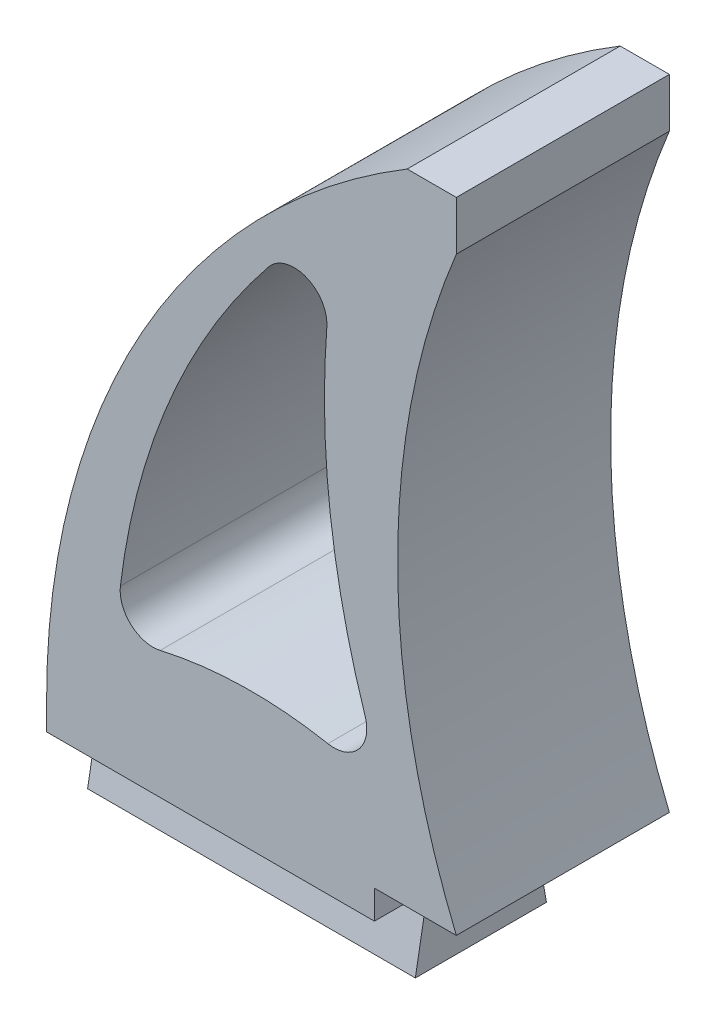
ISO-10303-21;
HEADER;
FILE_DESCRIPTION(('STEP AP214'),'2;1');
FILE_NAME('part.step','',(''),(''),'','','');
FILE_SCHEMA(('AUTOMOTIVE_DESIGN { 1 0 10303 214 1 1 1 1 }'));
ENDSEC;
DATA;
#1=APPLICATION_CONTEXT('core data for automotive mechanical design processes');
#2=APPLICATION_PROTOCOL_DEFINITION('international standard','automotive_design',2000,#1);
#3=PRODUCT_CONTEXT('',#1,'mechanical');
#4=PRODUCT('Part','Part','',(#3));
#5=PRODUCT_RELATED_PRODUCT_CATEGORY('part','',(#4));
#6=PRODUCT_DEFINITION_FORMATION('','',#4);
#7=PRODUCT_DEFINITION_CONTEXT('part definition',#1,'design');
#8=PRODUCT_DEFINITION('design','',#6,#7);
#9=PRODUCT_DEFINITION_SHAPE('','',#8);
#10=(LENGTH_UNIT() NAMED_UNIT(*) SI_UNIT(.MILLI.,.METRE.));
#11=(NAMED_UNIT(*) PLANE_ANGLE_UNIT() SI_UNIT($,.RADIAN.));
#12=(NAMED_UNIT(*) SI_UNIT($,.STERADIAN.) SOLID_ANGLE_UNIT());
#13=UNCERTAINTY_MEASURE_WITH_UNIT(LENGTH_MEASURE(1.E-05),#10,'distance_accuracy_value','');
#14=(GEOMETRIC_REPRESENTATION_CONTEXT(3) GLOBAL_UNCERTAINTY_ASSIGNED_CONTEXT((#13)) GLOBAL_UNIT_ASSIGNED_CONTEXT((#10,
#11,#12)) REPRESENTATION_CONTEXT('',''));
#15=CARTESIAN_POINT('',(0.,0.,0.));
#16=DIRECTION('',(0.,0.,1.));
#17=DIRECTION('',(1.,0.,0.));
#18=AXIS2_PLACEMENT_3D('',#15,#16,#17);
#19=CARTESIAN_POINT('',(45.5681818181818,6.,6.5));
#20=DIRECTION('',(0.,0.,-1.));
#21=DIRECTION('',(-1.,0.,0.));
#22=AXIS2_PLACEMENT_3D('',#19,#20,#21);
#23=PLANE('',#22);
#24=DIRECTION('',(0.,-1.,0.));
#25=VECTOR('',#24,1.);
#26=CARTESIAN_POINT('',(0.,0.,6.5));
#27=LINE('',#26,#25);
#28=CARTESIAN_POINT('',(0.,6.00000000000001,6.5));
#29=VERTEX_POINT('',#28);
#30=CARTESIAN_POINT('',(0.,4.25346136471317,6.5));
#31=VERTEX_POINT('',#30);
#32=EDGE_CURVE('E296',#29,#31,#27,.T.);
#33=ORIENTED_EDGE('',*,*,#32,.T.);
#34=DIRECTION('',(1.,0.,0.));
#35=VECTOR('',#34,1.);
#36=CARTESIAN_POINT('',(45.5681818181818,4.25346136471317,6.5));
#37=LINE('',#36,#35);
#38=CARTESIAN_POINT('',(20.,4.25346136471317,6.5));
#39=VERTEX_POINT('',#38);
#40=EDGE_CURVE('E11',#31,#39,#37,.T.);
#41=ORIENTED_EDGE('',*,*,#40,.T.);
#42=DIRECTION('',(0.,1.,0.));
#43=VECTOR('',#42,1.);
#44=CARTESIAN_POINT('',(20.,6.,6.5));
#45=LINE('',#44,#43);
#46=CARTESIAN_POINT('',(20.,6.,6.5));
#47=VERTEX_POINT('',#46);
#48=EDGE_CURVE('E277',#39,#47,#45,.T.);
#49=ORIENTED_EDGE('',*,*,#48,.T.);
#50=DIRECTION('',(1.,0.,0.));
#51=VECTOR('',#50,1.);
#52=CARTESIAN_POINT('',(25.,6.,6.5));
#53=LINE('',#52,#51);
#54=CARTESIAN_POINT('',(25.,6.00000000000001,6.5));
#55=VERTEX_POINT('',#54);
#56=EDGE_CURVE('E280',#47,#55,#53,.T.);
#57=ORIENTED_EDGE('',*,*,#56,.T.);
#58=CARTESIAN_POINT('',(68.4165866921848,24.,6.5));
#59=DIRECTION('',(0.,0.,-1.));
#60=DIRECTION('',(1.,0.,0.));
#61=AXIS2_PLACEMENT_3D('',#58,#59,#60);
#62=CIRCLE('',#61,47.);
#63=CARTESIAN_POINT('',(25.,42.,6.5));
#64=VERTEX_POINT('',#63);
#65=EDGE_CURVE('E284',#55,#64,#62,.T.);
#66=ORIENTED_EDGE('',*,*,#65,.T.);
#67=DIRECTION('',(0.,1.,0.));
#68=VECTOR('',#67,1.);
#69=CARTESIAN_POINT('',(25.,45.,6.5));
#70=LINE('',#69,#68);
#71=CARTESIAN_POINT('',(25.,45.,6.5));
#72=VERTEX_POINT('',#71);
#73=EDGE_CURVE('E287',#64,#72,#70,.T.);
#74=ORIENTED_EDGE('',*,*,#73,.T.);
#75=DIRECTION('',(-1.,0.,0.));
#76=VECTOR('',#75,1.);
#77=CARTESIAN_POINT('',(22.,45.,6.5));
#78=LINE('',#77,#76);
#79=CARTESIAN_POINT('',(22.,45.,6.5));
#80=VERTEX_POINT('',#79);
#81=EDGE_CURVE('E290',#72,#80,#78,.T.);
#82=ORIENTED_EDGE('',*,*,#81,.T.);
#83=CARTESIAN_POINT('',(45.5681818181818,6.,6.5));
#84=DIRECTION('',(0.,0.,1.));
#85=DIRECTION('',(-1.,0.,0.));
#86=AXIS2_PLACEMENT_3D('',#83,#84,#85);
#87=CIRCLE('',#86,45.5681818181818);
#88=EDGE_CURVE('E293',#80,#29,#87,.T.);
#89=ORIENTED_EDGE('',*,*,#88,.T.);
#90=EDGE_LOOP('',(#33,#41,#49,#57,#66,#74,#82,#89));
#91=FACE_BOUND('',#90,.T.);
#92=CARTESIAN_POINT('',(66.9514471110929,30.3695876679392,6.5));
#93=DIRECTION('',(0.,0.,-1.));
#94=DIRECTION('',(1.,0.,0.));
#95=AXIS2_PLACEMENT_3D('',#92,#93,#94);
#96=CIRCLE('',#95,50.);
#97=CARTESIAN_POINT('',(19.4364389930086,14.8028280970333,6.5));
#98=VERTEX_POINT('',#97);
#99=CARTESIAN_POINT('',(17.0977685869204,34.1919871248865,6.5));
#100=VERTEX_POINT('',#99);
#101=EDGE_CURVE('E205',#98,#100,#96,.T.);
#102=ORIENTED_EDGE('',*,*,#101,.F.);
#103=CARTESIAN_POINT('',(17.5358386682853,14.180157714197,6.5));
#104=DIRECTION('',(0.,0.,1.));
#105=DIRECTION('',(1.,0.,0.));
#106=AXIS2_PLACEMENT_3D('',#103,#104,#105);
#107=CIRCLE('',#106,2.);
#108=CARTESIAN_POINT('',(17.1628135817456,12.215252554956,6.5));
#109=VERTEX_POINT('',#108);
#110=EDGE_CURVE('E54',#109,#98,#107,.T.);
#111=ORIENTED_EDGE('',*,*,#110,.F.);
#112=CARTESIAN_POINT('',(12.5,-12.3460619355571,6.5));
#113=DIRECTION('',(0.,0.,-1.));
#114=DIRECTION('',(-1.,0.,0.));
#115=AXIS2_PLACEMENT_3D('',#112,#113,#114);
#116=CIRCLE('',#115,25.);
#117=CARTESIAN_POINT('',(6.9324638605244,12.026105414427,6.5));
#118=VERTEX_POINT('',#117);
#119=EDGE_CURVE('E185',#118,#109,#116,.T.);
#120=ORIENTED_EDGE('',*,*,#119,.F.);
#121=CARTESIAN_POINT('',(6.48706096936636,13.9758788024258,6.5));
#122=DIRECTION('',(0.,0.,1.));
#123=DIRECTION('',(-1.,0.,0.));
#124=AXIS2_PLACEMENT_3D('',#121,#122,#123);
#125=CIRCLE('',#124,2.);
#126=CARTESIAN_POINT('',(4.50146521068511,14.2154815634846,6.5));
#127=VERTEX_POINT('',#126);
#128=EDGE_CURVE('E189',#127,#118,#125,.T.);
#129=ORIENTED_EDGE('',*,*,#128,.F.);
#130=CARTESIAN_POINT('',(46.1989761429913,9.18382358124811,6.5));
#131=DIRECTION('',(0.,0.,1.));
#132=DIRECTION('',(-1.,0.,0.));
#133=AXIS2_PLACEMENT_3D('',#130,#131,#132);
#134=CIRCLE('',#133,42.);
#135=CARTESIAN_POINT('',(13.5488537111016,35.6029360792602,6.5));
#136=VERTEX_POINT('',#135);
#137=EDGE_CURVE('E212',#136,#127,#134,.T.);
#138=ORIENTED_EDGE('',*,*,#137,.F.);
#139=CARTESIAN_POINT('',(15.1036214459535,34.3448831031643,6.5));
#140=DIRECTION('',(0.,0.,1.));
#141=DIRECTION('',(-1.,0.,0.));
#142=AXIS2_PLACEMENT_3D('',#139,#140,#141);
#143=CIRCLE('',#142,2.);
#144=EDGE_CURVE('E208',#100,#136,#143,.T.);
#145=ORIENTED_EDGE('',*,*,#144,.F.);
#146=EDGE_LOOP('',(#102,#111,#120,#129,#138,#145));
#147=FACE_BOUND('',#146,.T.);
#148=ADVANCED_FACE('F38',(#91,#147),#23,.F.);
#149=CARTESIAN_POINT('',(45.5681818181818,6.,-6.5));
#150=DIRECTION('',(0.,0.,-1.));
#151=DIRECTION('',(-1.,0.,0.));
#152=AXIS2_PLACEMENT_3D('',#149,#150,#151);
#153=PLANE('',#152);
#154=DIRECTION('',(1.,0.,0.));
#155=VECTOR('',#154,1.);
#156=CARTESIAN_POINT('',(45.5681818181818,4.25346136471317,-6.5));
#157=LINE('',#156,#155);
#158=CARTESIAN_POINT('',(0.,4.25346136471317,-6.5));
#159=VERTEX_POINT('',#158);
#160=CARTESIAN_POINT('',(20.,4.25346136471317,-6.5));
#161=VERTEX_POINT('',#160);
#162=EDGE_CURVE('E47',#159,#161,#157,.T.);
#163=ORIENTED_EDGE('',*,*,#162,.F.);
#164=DIRECTION('',(0.,-1.,0.));
#165=VECTOR('',#164,1.);
#166=CARTESIAN_POINT('',(0.,0.,-6.5));
#167=LINE('',#166,#165);
#168=CARTESIAN_POINT('',(0.,6.00000000000001,-6.5));
#169=VERTEX_POINT('',#168);
#170=EDGE_CURVE('E281',#169,#159,#167,.T.);
#171=ORIENTED_EDGE('',*,*,#170,.F.);
#172=CARTESIAN_POINT('',(45.5681818181818,6.,-6.5));
#173=DIRECTION('',(0.,0.,1.));
#174=DIRECTION('',(-1.,0.,0.));
#175=AXIS2_PLACEMENT_3D('',#172,#173,#174);
#176=CIRCLE('',#175,45.5681818181818);
#177=CARTESIAN_POINT('',(22.,45.,-6.5));
#178=VERTEX_POINT('',#177);
#179=EDGE_CURVE('E315',#178,#169,#176,.T.);
#180=ORIENTED_EDGE('',*,*,#179,.F.);
#181=DIRECTION('',(-1.,0.,0.));
#182=VECTOR('',#181,1.);
#183=CARTESIAN_POINT('',(22.,45.,-6.5));
#184=LINE('',#183,#182);
#185=CARTESIAN_POINT('',(25.,45.,-6.5));
#186=VERTEX_POINT('',#185);
#187=EDGE_CURVE('E312',#186,#178,#184,.T.);
#188=ORIENTED_EDGE('',*,*,#187,.F.);
#189=DIRECTION('',(0.,1.,0.));
#190=VECTOR('',#189,1.);
#191=CARTESIAN_POINT('',(25.,45.,-6.5));
#192=LINE('',#191,#190);
#193=CARTESIAN_POINT('',(25.,42.,-6.5));
#194=VERTEX_POINT('',#193);
#195=EDGE_CURVE('E309',#194,#186,#192,.T.);
#196=ORIENTED_EDGE('',*,*,#195,.F.);
#197=CARTESIAN_POINT('',(68.4165866921848,24.,-6.5));
#198=DIRECTION('',(0.,0.,-1.));
#199=DIRECTION('',(1.,0.,0.));
#200=AXIS2_PLACEMENT_3D('',#197,#198,#199);
#201=CIRCLE('',#200,47.);
#202=CARTESIAN_POINT('',(25.,6.00000000000001,-6.5));
#203=VERTEX_POINT('',#202);
#204=EDGE_CURVE('E306',#203,#194,#201,.T.);
#205=ORIENTED_EDGE('',*,*,#204,.F.);
#206=DIRECTION('',(1.,0.,0.));
#207=VECTOR('',#206,1.);
#208=CARTESIAN_POINT('',(25.,6.,-6.5));
#209=LINE('',#208,#207);
#210=CARTESIAN_POINT('',(20.,6.,-6.5));
#211=VERTEX_POINT('',#210);
#212=EDGE_CURVE('E303',#211,#203,#209,.T.);
#213=ORIENTED_EDGE('',*,*,#212,.F.);
#214=DIRECTION('',(0.,1.,0.));
#215=VECTOR('',#214,1.);
#216=CARTESIAN_POINT('',(20.,6.,-6.5));
#217=LINE('',#216,#215);
#218=EDGE_CURVE('E276',#161,#211,#217,.T.);
#219=ORIENTED_EDGE('',*,*,#218,.F.);
#220=EDGE_LOOP('',(#163,#171,#180,#188,#196,#205,#213,#219));
#221=FACE_BOUND('',#220,.T.);
#222=CARTESIAN_POINT('',(17.5358386682853,14.180157714197,-6.5));
#223=DIRECTION('',(0.,0.,1.));
#224=DIRECTION('',(1.,0.,0.));
#225=AXIS2_PLACEMENT_3D('',#222,#223,#224);
#226=CIRCLE('',#225,2.);
#227=CARTESIAN_POINT('',(17.1628135817456,12.215252554956,-6.5));
#228=VERTEX_POINT('',#227);
#229=CARTESIAN_POINT('',(19.4364389930086,14.8028280970333,-6.5));
#230=VERTEX_POINT('',#229);
#231=EDGE_CURVE('E166',#228,#230,#226,.T.);
#232=ORIENTED_EDGE('',*,*,#231,.T.);
#233=CARTESIAN_POINT('',(66.9514471110929,30.3695876679392,-6.5));
#234=DIRECTION('',(0.,0.,-1.));
#235=DIRECTION('',(1.,0.,0.));
#236=AXIS2_PLACEMENT_3D('',#233,#234,#235);
#237=CIRCLE('',#236,50.);
#238=CARTESIAN_POINT('',(17.0977685869204,34.1919871248865,-6.5));
#239=VERTEX_POINT('',#238);
#240=EDGE_CURVE('E176',#230,#239,#237,.T.);
#241=ORIENTED_EDGE('',*,*,#240,.T.);
#242=CARTESIAN_POINT('',(15.1036214459535,34.3448831031643,-6.5));
#243=DIRECTION('',(0.,0.,1.));
#244=DIRECTION('',(-1.,0.,0.));
#245=AXIS2_PLACEMENT_3D('',#242,#243,#244);
#246=CIRCLE('',#245,2.);
#247=CARTESIAN_POINT('',(13.5488537111016,35.6029360792602,-6.5));
#248=VERTEX_POINT('',#247);
#249=EDGE_CURVE('E62',#239,#248,#246,.T.);
#250=ORIENTED_EDGE('',*,*,#249,.T.);
#251=CARTESIAN_POINT('',(46.1989761429913,9.18382358124811,-6.5));
#252=DIRECTION('',(0.,0.,1.));
#253=DIRECTION('',(-1.,0.,0.));
#254=AXIS2_PLACEMENT_3D('',#251,#252,#253);
#255=CIRCLE('',#254,42.);
#256=CARTESIAN_POINT('',(4.50146521068511,14.2154815634846,-6.5));
#257=VERTEX_POINT('',#256);
#258=EDGE_CURVE('E194',#248,#257,#255,.T.);
#259=ORIENTED_EDGE('',*,*,#258,.T.);
#260=CARTESIAN_POINT('',(6.48706096936636,13.9758788024258,-6.5));
#261=DIRECTION('',(0.,0.,1.));
#262=DIRECTION('',(-1.,0.,0.));
#263=AXIS2_PLACEMENT_3D('',#260,#261,#262);
#264=CIRCLE('',#263,2.);
#265=CARTESIAN_POINT('',(6.9324638605244,12.026105414427,-6.5));
#266=VERTEX_POINT('',#265);
#267=EDGE_CURVE('E198',#257,#266,#264,.T.);
#268=ORIENTED_EDGE('',*,*,#267,.T.);
#269=CARTESIAN_POINT('',(12.5,-12.3460619355571,-6.5));
#270=DIRECTION('',(0.,0.,-1.));
#271=DIRECTION('',(-1.,0.,0.));
#272=AXIS2_PLACEMENT_3D('',#269,#270,#271);
#273=CIRCLE('',#272,25.);
#274=EDGE_CURVE('E173',#266,#228,#273,.T.);
#275=ORIENTED_EDGE('',*,*,#274,.T.);
#276=EDGE_LOOP('',(#232,#241,#250,#259,#268,#275));
#277=FACE_BOUND('',#276,.T.);
#278=ADVANCED_FACE('F181',(#221,#277),#153,.T.);
#279=CARTESIAN_POINT('',(20.,0.,6.5));
#280=DIRECTION('',(0.,1.,0.));
#281=DIRECTION('',(-1.,0.,0.));
#282=AXIS2_PLACEMENT_3D('',#279,#280,#281);
#283=PLANE('',#282);
#284=DIRECTION('',(0.,0.,-1.));
#285=VECTOR('',#284,1.);
#286=CARTESIAN_POINT('',(20.,0.,6.5));
#287=LINE('',#286,#285);
#288=CARTESIAN_POINT('',(20.,0.,4.));
#289=VERTEX_POINT('',#288);
#290=CARTESIAN_POINT('',(20.,0.,-4.));
#291=VERTEX_POINT('',#290);
#292=EDGE_CURVE('E348',#289,#291,#287,.T.);
#293=ORIENTED_EDGE('',*,*,#292,.F.);
#294=DIRECTION('',(-1.,0.,0.));
#295=VECTOR('',#294,1.);
#296=CARTESIAN_POINT('',(25.,0.,4.));
#297=LINE('',#296,#295);
#298=CARTESIAN_POINT('',(0.,0.,4.));
#299=VERTEX_POINT('',#298);
#300=EDGE_CURVE('E243',#289,#299,#297,.T.);
#301=ORIENTED_EDGE('',*,*,#300,.T.);
#302=DIRECTION('',(0.,0.,-1.));
#303=VECTOR('',#302,1.);
#304=CARTESIAN_POINT('',(0.,0.,6.5));
#305=LINE('',#304,#303);
#306=CARTESIAN_POINT('',(0.,0.,-4.));
#307=VERTEX_POINT('',#306);
#308=EDGE_CURVE('E300',#299,#307,#305,.T.);
#309=ORIENTED_EDGE('',*,*,#308,.T.);
#310=DIRECTION('',(-1.,0.,0.));
#311=VECTOR('',#310,1.);
#312=CARTESIAN_POINT('',(25.,0.,-4.));
#313=LINE('',#312,#311);
#314=EDGE_CURVE('E239',#291,#307,#313,.T.);
#315=ORIENTED_EDGE('',*,*,#314,.F.);
#316=EDGE_LOOP('',(#293,#301,#309,#315));
#317=FACE_BOUND('',#316,.T.);
#318=ADVANCED_FACE('F40',(#317),#283,.F.);
#319=CARTESIAN_POINT('',(20.,6.,6.5));
#320=DIRECTION('',(-1.,0.,0.));
#321=DIRECTION('',(0.,0.,1.));
#322=AXIS2_PLACEMENT_3D('',#319,#320,#321);
#323=PLANE('',#322);
#324=DIRECTION('',(0.,0.,-1.));
#325=VECTOR('',#324,1.);
#326=CARTESIAN_POINT('',(20.,4.25346136471317,6.5));
#327=LINE('',#326,#325);
#328=CARTESIAN_POINT('',(20.,4.25346136471317,3.25));
#329=VERTEX_POINT('',#328);
#330=EDGE_CURVE('E264',#39,#329,#327,.T.);
#331=ORIENTED_EDGE('',*,*,#330,.T.);
#332=DIRECTION('',(0.,-0.984807753012207,0.173648177666935));
#333=VECTOR('',#332,1.);
#334=CARTESIAN_POINT('',(20.,5.39155268320062,3.04932379404059));
#335=LINE('',#334,#333);
#336=EDGE_CURVE('E272',#329,#289,#335,.T.);
#337=ORIENTED_EDGE('',*,*,#336,.T.);
#338=ORIENTED_EDGE('',*,*,#292,.T.);
#339=DIRECTION('',(0.,0.984807753012207,0.173648177666935));
#340=VECTOR('',#339,1.);
#341=CARTESIAN_POINT('',(20.,7.61468361481752,-2.65732582914897));
#342=LINE('',#341,#340);
#343=CARTESIAN_POINT('',(20.,4.25346136471317,-3.25));
#344=VERTEX_POINT('',#343);
#345=EDGE_CURVE('E268',#291,#344,#342,.T.);
#346=ORIENTED_EDGE('',*,*,#345,.T.);
#347=DIRECTION('',(0.,0.,-1.));
#348=VECTOR('',#347,1.);
#349=CARTESIAN_POINT('',(20.,4.25346136471317,6.5));
#350=LINE('',#349,#348);
#351=EDGE_CURVE('E247',#344,#161,#350,.T.);
#352=ORIENTED_EDGE('',*,*,#351,.T.);
#353=ORIENTED_EDGE('',*,*,#218,.T.);
#354=DIRECTION('',(0.,0.,-1.));
#355=VECTOR('',#354,1.);
#356=CARTESIAN_POINT('',(20.,6.,6.5));
#357=LINE('',#356,#355);
#358=EDGE_CURVE('E344',#47,#211,#357,.T.);
#359=ORIENTED_EDGE('',*,*,#358,.F.);
#360=ORIENTED_EDGE('',*,*,#48,.F.);
#361=EDGE_LOOP('',(#331,#337,#338,#346,#352,#353,#359,#360));
#362=FACE_BOUND('',#361,.T.);
#363=ADVANCED_FACE('F361',(#362),#323,.F.);
#364=CARTESIAN_POINT('',(25.,6.,6.5));
#365=DIRECTION('',(0.,1.,0.));
#366=DIRECTION('',(0.,0.,1.));
#367=AXIS2_PLACEMENT_3D('',#364,#365,#366);
#368=PLANE('',#367);
#369=ORIENTED_EDGE('',*,*,#212,.T.);
#370=DIRECTION('',(0.,0.,-1.));
#371=VECTOR('',#370,1.);
#372=CARTESIAN_POINT('',(25.,6.00000000000001,6.5));
#373=LINE('',#372,#371);
#374=EDGE_CURVE('E340',#55,#203,#373,.T.);
#375=ORIENTED_EDGE('',*,*,#374,.F.);
#376=ORIENTED_EDGE('',*,*,#56,.F.);
#377=ORIENTED_EDGE('',*,*,#358,.T.);
#378=EDGE_LOOP('',(#369,#375,#376,#377));
#379=FACE_BOUND('',#378,.T.);
#380=ADVANCED_FACE('F368',(#379),#368,.F.);
#381=CARTESIAN_POINT('',(68.4165866921848,24.,6.5));
#382=DIRECTION('',(0.,0.,-1.));
#383=DIRECTION('',(-1.,0.,0.));
#384=AXIS2_PLACEMENT_3D('',#381,#382,#383);
#385=CYLINDRICAL_SURFACE('',#384,47.);
#386=ORIENTED_EDGE('',*,*,#204,.T.);
#387=DIRECTION('',(0.,0.,-1.));
#388=VECTOR('',#387,1.);
#389=CARTESIAN_POINT('',(25.,42.,6.5));
#390=LINE('',#389,#388);
#391=EDGE_CURVE('E336',#64,#194,#390,.T.);
#392=ORIENTED_EDGE('',*,*,#391,.F.);
#393=ORIENTED_EDGE('',*,*,#65,.F.);
#394=ORIENTED_EDGE('',*,*,#374,.T.);
#395=EDGE_LOOP('',(#386,#392,#393,#394));
#396=FACE_BOUND('',#395,.T.);
#397=ADVANCED_FACE('F372',(#396),#385,.F.);
#398=CARTESIAN_POINT('',(25.,45.,6.5));
#399=DIRECTION('',(-1.,0.,0.));
#400=DIRECTION('',(0.,0.,1.));
#401=AXIS2_PLACEMENT_3D('',#398,#399,#400);
#402=PLANE('',#401);
#403=ORIENTED_EDGE('',*,*,#195,.T.);
#404=DIRECTION('',(0.,0.,-1.));
#405=VECTOR('',#404,1.);
#406=CARTESIAN_POINT('',(25.,45.,6.5));
#407=LINE('',#406,#405);
#408=EDGE_CURVE('E332',#72,#186,#407,.T.);
#409=ORIENTED_EDGE('',*,*,#408,.F.);
#410=ORIENTED_EDGE('',*,*,#73,.F.);
#411=ORIENTED_EDGE('',*,*,#391,.T.);
#412=EDGE_LOOP('',(#403,#409,#410,#411));
#413=FACE_BOUND('',#412,.T.);
#414=ADVANCED_FACE('F417',(#413),#402,.F.);
#415=CARTESIAN_POINT('',(22.,45.,6.5));
#416=DIRECTION('',(0.,-1.,0.));
#417=DIRECTION('',(0.,0.,-1.));
#418=AXIS2_PLACEMENT_3D('',#415,#416,#417);
#419=PLANE('',#418);
#420=ORIENTED_EDGE('',*,*,#187,.T.);
#421=DIRECTION('',(0.,0.,-1.));
#422=VECTOR('',#421,1.);
#423=CARTESIAN_POINT('',(22.,45.,6.5));
#424=LINE('',#423,#422);
#425=EDGE_CURVE('E328',#80,#178,#424,.T.);
#426=ORIENTED_EDGE('',*,*,#425,.F.);
#427=ORIENTED_EDGE('',*,*,#81,.F.);
#428=ORIENTED_EDGE('',*,*,#408,.T.);
#429=EDGE_LOOP('',(#420,#426,#427,#428));
#430=FACE_BOUND('',#429,.T.);
#431=ADVANCED_FACE('F413',(#430),#419,.F.);
#432=CARTESIAN_POINT('',(45.5681818181818,6.,6.5));
#433=DIRECTION('',(0.,0.,-1.));
#434=DIRECTION('',(-1.,0.,0.));
#435=AXIS2_PLACEMENT_3D('',#432,#433,#434);
#436=CYLINDRICAL_SURFACE('',#435,45.5681818181818);
#437=ORIENTED_EDGE('',*,*,#179,.T.);
#438=DIRECTION('',(0.,0.,-1.));
#439=VECTOR('',#438,1.);
#440=CARTESIAN_POINT('',(0.,6.00000000000001,6.5));
#441=LINE('',#440,#439);
#442=EDGE_CURVE('E324',#29,#169,#441,.T.);
#443=ORIENTED_EDGE('',*,*,#442,.F.);
#444=ORIENTED_EDGE('',*,*,#88,.F.);
#445=ORIENTED_EDGE('',*,*,#425,.T.);
#446=EDGE_LOOP('',(#437,#443,#444,#445));
#447=FACE_BOUND('',#446,.T.);
#448=ADVANCED_FACE('F402',(#447),#436,.T.);
#449=CARTESIAN_POINT('',(0.,0.,6.5));
#450=DIRECTION('',(1.,0.,0.));
#451=DIRECTION('',(0.,0.,-1.));
#452=AXIS2_PLACEMENT_3D('',#449,#450,#451);
#453=PLANE('',#452);
#454=ORIENTED_EDGE('',*,*,#308,.F.);
#455=DIRECTION('',(0.,-0.984807753012207,0.173648177666935));
#456=VECTOR('',#455,1.);
#457=CARTESIAN_POINT('',(0.,4.25346136471317,3.25));
#458=LINE('',#457,#456);
#459=CARTESIAN_POINT('',(0.,4.25346136471317,3.25));
#460=VERTEX_POINT('',#459);
#461=EDGE_CURVE('E238',#460,#299,#458,.T.);
#462=ORIENTED_EDGE('',*,*,#461,.F.);
#463=DIRECTION('',(0.,0.,-1.));
#464=VECTOR('',#463,1.);
#465=CARTESIAN_POINT('',(0.,4.25346136471317,6.5));
#466=LINE('',#465,#464);
#467=EDGE_CURVE('E234',#31,#460,#466,.T.);
#468=ORIENTED_EDGE('',*,*,#467,.F.);
#469=ORIENTED_EDGE('',*,*,#32,.F.);
#470=ORIENTED_EDGE('',*,*,#442,.T.);
#471=ORIENTED_EDGE('',*,*,#170,.T.);
#472=DIRECTION('',(0.,0.,-1.));
#473=VECTOR('',#472,1.);
#474=CARTESIAN_POINT('',(0.,4.25346136471317,-6.5));
#475=LINE('',#474,#473);
#476=CARTESIAN_POINT('',(0.,4.25346136471317,-3.25));
#477=VERTEX_POINT('',#476);
#478=EDGE_CURVE('E253',#477,#159,#475,.T.);
#479=ORIENTED_EDGE('',*,*,#478,.F.);
#480=DIRECTION('',(0.,0.984807753012207,0.173648177666935));
#481=VECTOR('',#480,1.);
#482=CARTESIAN_POINT('',(0.,4.25346136471317,-3.25));
#483=LINE('',#482,#481);
#484=EDGE_CURVE('E222',#307,#477,#483,.T.);
#485=ORIENTED_EDGE('',*,*,#484,.F.);
#486=EDGE_LOOP('',(#454,#462,#468,#469,#470,#471,#479,#485));
#487=FACE_BOUND('',#486,.T.);
#488=ADVANCED_FACE('F392',(#487),#453,.F.);
#489=CARTESIAN_POINT('',(25.,4.25346136471317,-3.25));
#490=DIRECTION('',(0.,-0.173648177666935,0.984807753012207));
#491=DIRECTION('',(0.,-0.984807753012207,-0.173648177666935));
#492=AXIS2_PLACEMENT_3D('',#489,#490,#491);
#493=PLANE('',#492);
#494=ORIENTED_EDGE('',*,*,#314,.T.);
#495=ORIENTED_EDGE('',*,*,#484,.T.);
#496=DIRECTION('',(-1.,0.,0.));
#497=VECTOR('',#496,1.);
#498=CARTESIAN_POINT('',(25.,4.25346136471317,-3.25));
#499=LINE('',#498,#497);
#500=EDGE_CURVE('E256',#344,#477,#499,.T.);
#501=ORIENTED_EDGE('',*,*,#500,.F.);
#502=ORIENTED_EDGE('',*,*,#345,.F.);
#503=EDGE_LOOP('',(#494,#495,#501,#502));
#504=FACE_BOUND('',#503,.T.);
#505=ADVANCED_FACE('F394',(#504),#493,.F.);
#506=CARTESIAN_POINT('',(25.,4.25346136471317,-6.5));
#507=DIRECTION('',(0.,1.,0.));
#508=DIRECTION('',(0.,0.,1.));
#509=AXIS2_PLACEMENT_3D('',#506,#507,#508);
#510=PLANE('',#509);
#511=ORIENTED_EDGE('',*,*,#500,.T.);
#512=ORIENTED_EDGE('',*,*,#478,.T.);
#513=ORIENTED_EDGE('',*,*,#162,.T.);
#514=ORIENTED_EDGE('',*,*,#351,.F.);
#515=EDGE_LOOP('',(#511,#512,#513,#514));
#516=FACE_BOUND('',#515,.T.);
#517=ADVANCED_FACE('F354',(#516),#510,.F.);
#518=CARTESIAN_POINT('',(25.,4.25346136471317,3.25));
#519=DIRECTION('',(0.,-0.173648177666935,-0.984807753012207));
#520=DIRECTION('',(0.,0.984807753012207,-0.173648177666935));
#521=AXIS2_PLACEMENT_3D('',#518,#519,#520);
#522=PLANE('',#521);
#523=DIRECTION('',(-1.,0.,0.));
#524=VECTOR('',#523,1.);
#525=CARTESIAN_POINT('',(25.,4.25346136471317,3.25));
#526=LINE('',#525,#524);
#527=EDGE_CURVE('E242',#329,#460,#526,.T.);
#528=ORIENTED_EDGE('',*,*,#527,.T.);
#529=ORIENTED_EDGE('',*,*,#461,.T.);
#530=ORIENTED_EDGE('',*,*,#300,.F.);
#531=ORIENTED_EDGE('',*,*,#336,.F.);
#532=EDGE_LOOP('',(#528,#529,#530,#531));
#533=FACE_BOUND('',#532,.T.);
#534=ADVANCED_FACE('F386',(#533),#522,.F.);
#535=CARTESIAN_POINT('',(25.,4.25346136471317,6.5));
#536=DIRECTION('',(0.,1.,0.));
#537=DIRECTION('',(0.,0.,1.));
#538=AXIS2_PLACEMENT_3D('',#535,#536,#537);
#539=PLANE('',#538);
#540=ORIENTED_EDGE('',*,*,#40,.F.);
#541=ORIENTED_EDGE('',*,*,#467,.T.);
#542=ORIENTED_EDGE('',*,*,#527,.F.);
#543=ORIENTED_EDGE('',*,*,#330,.F.);
#544=EDGE_LOOP('',(#540,#541,#542,#543));
#545=FACE_BOUND('',#544,.T.);
#546=ADVANCED_FACE('F382',(#545),#539,.F.);
#547=CARTESIAN_POINT('',(17.5358386682853,14.180157714197,-6.5));
#548=DIRECTION('',(0.,0.,1.));
#549=DIRECTION('',(1.,0.,0.));
#550=AXIS2_PLACEMENT_3D('',#547,#548,#549);
#551=CYLINDRICAL_SURFACE('',#550,2.);
#552=ORIENTED_EDGE('',*,*,#110,.T.);
#553=DIRECTION('',(0.,0.,1.));
#554=VECTOR('',#553,1.);
#555=CARTESIAN_POINT('',(19.4364389930086,14.8028280970333,-6.5));
#556=LINE('',#555,#554);
#557=EDGE_CURVE('E162',#230,#98,#556,.T.);
#558=ORIENTED_EDGE('',*,*,#557,.F.);
#559=ORIENTED_EDGE('',*,*,#231,.F.);
#560=DIRECTION('',(0.,0.,1.));
#561=VECTOR('',#560,1.);
#562=CARTESIAN_POINT('',(17.1628135817456,12.215252554956,-6.5));
#563=LINE('',#562,#561);
#564=EDGE_CURVE('E219',#228,#109,#563,.T.);
#565=ORIENTED_EDGE('',*,*,#564,.T.);
#566=EDGE_LOOP('',(#552,#558,#559,#565));
#567=FACE_BOUND('',#566,.T.);
#568=ADVANCED_FACE('F164',(#567),#551,.F.);
#569=CARTESIAN_POINT('',(12.5,-12.3460619355571,-6.5));
#570=DIRECTION('',(0.,0.,1.));
#571=DIRECTION('',(1.,0.,0.));
#572=AXIS2_PLACEMENT_3D('',#569,#570,#571);
#573=CYLINDRICAL_SURFACE('',#572,25.);
#574=ORIENTED_EDGE('',*,*,#119,.T.);
#575=ORIENTED_EDGE('',*,*,#564,.F.);
#576=ORIENTED_EDGE('',*,*,#274,.F.);
#577=DIRECTION('',(0.,0.,1.));
#578=VECTOR('',#577,1.);
#579=CARTESIAN_POINT('',(6.9324638605244,12.026105414427,-6.5));
#580=LINE('',#579,#578);
#581=EDGE_CURVE('E223',#266,#118,#580,.T.);
#582=ORIENTED_EDGE('',*,*,#581,.T.);
#583=EDGE_LOOP('',(#574,#575,#576,#582));
#584=FACE_BOUND('',#583,.T.);
#585=ADVANCED_FACE('F449',(#584),#573,.T.);
#586=CARTESIAN_POINT('',(6.48706096936636,13.9758788024258,-6.5));
#587=DIRECTION('',(0.,0.,1.));
#588=DIRECTION('',(1.,0.,0.));
#589=AXIS2_PLACEMENT_3D('',#586,#587,#588);
#590=CYLINDRICAL_SURFACE('',#589,2.);
#591=ORIENTED_EDGE('',*,*,#128,.T.);
#592=ORIENTED_EDGE('',*,*,#581,.F.);
#593=ORIENTED_EDGE('',*,*,#267,.F.);
#594=DIRECTION('',(0.,0.,1.));
#595=VECTOR('',#594,1.);
#596=CARTESIAN_POINT('',(4.50146521068511,14.2154815634846,-6.5));
#597=LINE('',#596,#595);
#598=EDGE_CURVE('E226',#257,#127,#597,.T.);
#599=ORIENTED_EDGE('',*,*,#598,.T.);
#600=EDGE_LOOP('',(#591,#592,#593,#599));
#601=FACE_BOUND('',#600,.T.);
#602=ADVANCED_FACE('F459',(#601),#590,.F.);
#603=CARTESIAN_POINT('',(46.1989761429913,9.18382358124811,-6.5));
#604=DIRECTION('',(0.,0.,1.));
#605=DIRECTION('',(1.,0.,0.));
#606=AXIS2_PLACEMENT_3D('',#603,#604,#605);
#607=CYLINDRICAL_SURFACE('',#606,42.);
#608=ORIENTED_EDGE('',*,*,#137,.T.);
#609=ORIENTED_EDGE('',*,*,#598,.F.);
#610=ORIENTED_EDGE('',*,*,#258,.F.);
#611=DIRECTION('',(0.,0.,1.));
#612=VECTOR('',#611,1.);
#613=CARTESIAN_POINT('',(13.5488537111016,35.6029360792602,-6.5));
#614=LINE('',#613,#612);
#615=EDGE_CURVE('E229',#248,#136,#614,.T.);
#616=ORIENTED_EDGE('',*,*,#615,.T.);
#617=EDGE_LOOP('',(#608,#609,#610,#616));
#618=FACE_BOUND('',#617,.T.);
#619=ADVANCED_FACE('F469',(#618),#607,.F.);
#620=CARTESIAN_POINT('',(15.1036214459535,34.3448831031643,-6.5));
#621=DIRECTION('',(0.,0.,1.));
#622=DIRECTION('',(1.,0.,0.));
#623=AXIS2_PLACEMENT_3D('',#620,#621,#622);
#624=CYLINDRICAL_SURFACE('',#623,2.);
#625=ORIENTED_EDGE('',*,*,#144,.T.);
#626=ORIENTED_EDGE('',*,*,#615,.F.);
#627=ORIENTED_EDGE('',*,*,#249,.F.);
#628=DIRECTION('',(0.,0.,1.));
#629=VECTOR('',#628,1.);
#630=CARTESIAN_POINT('',(17.0977685869204,34.1919871248865,-6.5));
#631=LINE('',#630,#629);
#632=EDGE_CURVE('E172',#239,#100,#631,.T.);
#633=ORIENTED_EDGE('',*,*,#632,.T.);
#634=EDGE_LOOP('',(#625,#626,#627,#633));
#635=FACE_BOUND('',#634,.T.);
#636=ADVANCED_FACE('F479',(#635),#624,.F.);
#637=CARTESIAN_POINT('',(66.9514471110929,30.3695876679392,-6.5));
#638=DIRECTION('',(0.,0.,1.));
#639=DIRECTION('',(1.,0.,0.));
#640=AXIS2_PLACEMENT_3D('',#637,#638,#639);
#641=CYLINDRICAL_SURFACE('',#640,50.);
#642=ORIENTED_EDGE('',*,*,#101,.T.);
#643=ORIENTED_EDGE('',*,*,#632,.F.);
#644=ORIENTED_EDGE('',*,*,#240,.F.);
#645=ORIENTED_EDGE('',*,*,#557,.T.);
#646=EDGE_LOOP('',(#642,#643,#644,#645));
#647=FACE_BOUND('',#646,.T.);
#648=ADVANCED_FACE('F177',(#647),#641,.T.);
#649=CLOSED_SHELL('',(#148,#278,#318,#363,#380,#397,#414,#431,#448,#488,#505,#517,#534,#546,
#568,#585,#602,#619,#636,#648));
#650=MANIFOLD_SOLID_BREP('B2',#649);
#651=ADVANCED_BREP_SHAPE_REPRESENTATION('',(#18,#650),#14);
#652=SHAPE_DEFINITION_REPRESENTATION(#9,#651);
ENDSEC;
END-ISO-10303-21;
